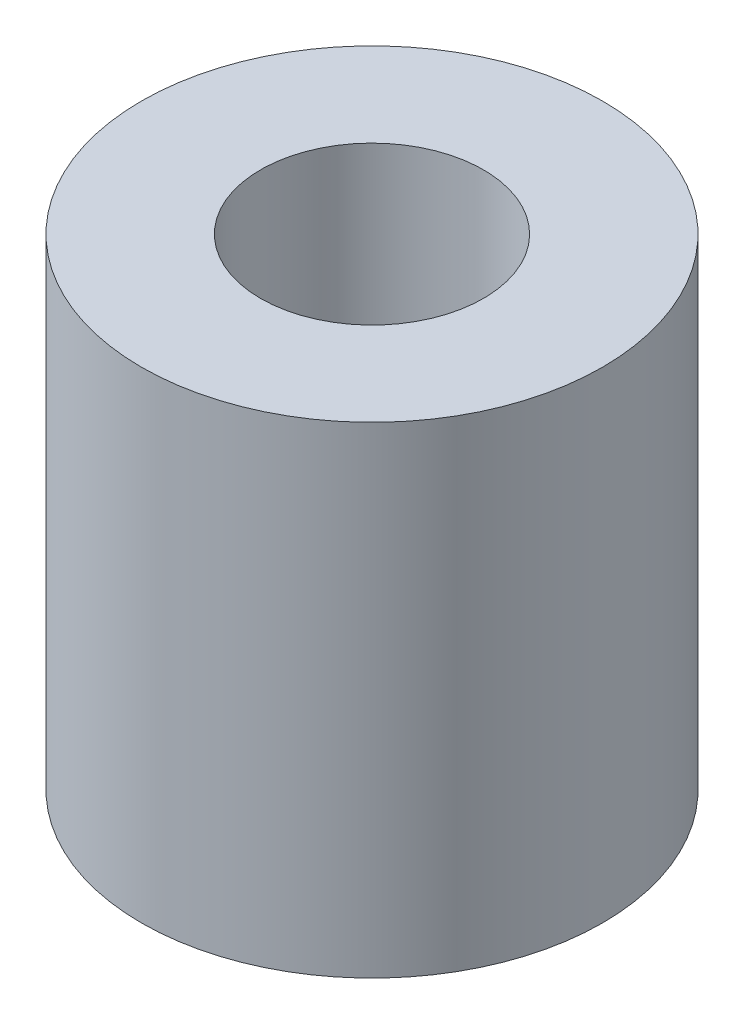
ISO-10303-21;
HEADER;
FILE_DESCRIPTION(('STEP AP214'),'2;1');
FILE_NAME('part.step','',(''),(''),'','','');
FILE_SCHEMA(('AUTOMOTIVE_DESIGN { 1 0 10303 214 1 1 1 1 }'));
ENDSEC;
DATA;
#1=APPLICATION_CONTEXT('core data for automotive mechanical design processes');
#2=APPLICATION_PROTOCOL_DEFINITION('international standard','automotive_design',2000,#1);
#3=PRODUCT_CONTEXT('',#1,'mechanical');
#4=PRODUCT('Part','Part','',(#3));
#5=PRODUCT_RELATED_PRODUCT_CATEGORY('part','',(#4));
#6=PRODUCT_DEFINITION_FORMATION('','',#4);
#7=PRODUCT_DEFINITION_CONTEXT('part definition',#1,'design');
#8=PRODUCT_DEFINITION('design','',#6,#7);
#9=PRODUCT_DEFINITION_SHAPE('','',#8);
#10=(LENGTH_UNIT() NAMED_UNIT(*) SI_UNIT(.MILLI.,.METRE.));
#11=(NAMED_UNIT(*) PLANE_ANGLE_UNIT() SI_UNIT($,.RADIAN.));
#12=(NAMED_UNIT(*) SI_UNIT($,.STERADIAN.) SOLID_ANGLE_UNIT());
#13=UNCERTAINTY_MEASURE_WITH_UNIT(LENGTH_MEASURE(1.E-05),#10,'distance_accuracy_value','');
#14=(GEOMETRIC_REPRESENTATION_CONTEXT(3) GLOBAL_UNCERTAINTY_ASSIGNED_CONTEXT((#13)) GLOBAL_UNIT_ASSIGNED_CONTEXT((#10,
#11,#12)) REPRESENTATION_CONTEXT('',''));
#15=CARTESIAN_POINT('',(0.,0.,0.));
#16=DIRECTION('',(0.,0.,1.));
#17=DIRECTION('',(1.,0.,0.));
#18=AXIS2_PLACEMENT_3D('',#15,#16,#17);
#19=CARTESIAN_POINT('',(0.,9.5,0.));
#20=DIRECTION('',(0.,1.,0.));
#21=DIRECTION('',(0.,0.,1.));
#22=AXIS2_PLACEMENT_3D('',#19,#20,#21);
#23=PLANE('',#22);
#24=CARTESIAN_POINT('',(0.,9.5,0.));
#25=DIRECTION('',(0.,1.,0.));
#26=DIRECTION('',(0.,0.,1.));
#27=AXIS2_PLACEMENT_3D('',#24,#25,#26);
#28=CIRCLE('',#27,4.55);
#29=CARTESIAN_POINT('',(0.,9.5,4.55));
#30=VERTEX_POINT('',#29);
#31=EDGE_CURVE('E10',#30,#30,#28,.T.);
#32=ORIENTED_EDGE('',*,*,#31,.T.);
#33=EDGE_LOOP('',(#32));
#34=FACE_BOUND('',#33,.T.);
#35=CARTESIAN_POINT('',(0.,9.5,0.));
#36=DIRECTION('',(0.,1.,0.));
#37=DIRECTION('',(0.,0.,1.));
#38=AXIS2_PLACEMENT_3D('',#35,#36,#37);
#39=CIRCLE('',#38,2.2);
#40=CARTESIAN_POINT('',(0.,9.5,2.2));
#41=VERTEX_POINT('',#40);
#42=EDGE_CURVE('E44',#41,#41,#39,.T.);
#43=ORIENTED_EDGE('',*,*,#42,.F.);
#44=EDGE_LOOP('',(#43));
#45=FACE_BOUND('',#44,.T.);
#46=ADVANCED_FACE('F33',(#34,#45),#23,.T.);
#47=CARTESIAN_POINT('',(0.,0.,0.));
#48=DIRECTION('',(0.,1.,0.));
#49=DIRECTION('',(0.,0.,1.));
#50=AXIS2_PLACEMENT_3D('',#47,#48,#49);
#51=PLANE('',#50);
#52=CARTESIAN_POINT('',(0.,0.,0.));
#53=DIRECTION('',(0.,1.,0.));
#54=DIRECTION('',(0.,0.,1.));
#55=AXIS2_PLACEMENT_3D('',#52,#53,#54);
#56=CIRCLE('',#55,4.55);
#57=CARTESIAN_POINT('',(0.,0.,4.55));
#58=VERTEX_POINT('',#57);
#59=EDGE_CURVE('E37',#58,#58,#56,.T.);
#60=ORIENTED_EDGE('',*,*,#59,.F.);
#61=EDGE_LOOP('',(#60));
#62=FACE_BOUND('',#61,.T.);
#63=CARTESIAN_POINT('',(0.,0.,0.));
#64=DIRECTION('',(0.,1.,0.));
#65=DIRECTION('',(0.,0.,1.));
#66=AXIS2_PLACEMENT_3D('',#63,#64,#65);
#67=CIRCLE('',#66,2.2);
#68=CARTESIAN_POINT('',(0.,0.,2.2));
#69=VERTEX_POINT('',#68);
#70=EDGE_CURVE('E46',#69,#69,#67,.T.);
#71=ORIENTED_EDGE('',*,*,#70,.T.);
#72=EDGE_LOOP('',(#71));
#73=FACE_BOUND('',#72,.T.);
#74=ADVANCED_FACE('F56',(#62,#73),#51,.F.);
#75=CARTESIAN_POINT('',(0.,9.5,0.));
#76=DIRECTION('',(0.,-1.,0.));
#77=DIRECTION('',(0.,0.,-1.));
#78=AXIS2_PLACEMENT_3D('',#75,#76,#77);
#79=CYLINDRICAL_SURFACE('',#78,4.55);
#80=ORIENTED_EDGE('',*,*,#31,.F.);
#81=EDGE_LOOP('',(#80));
#82=FACE_BOUND('',#81,.T.);
#83=ORIENTED_EDGE('',*,*,#59,.T.);
#84=EDGE_LOOP('',(#83));
#85=FACE_BOUND('',#84,.T.);
#86=ADVANCED_FACE('F35',(#82,#85),#79,.T.);
#87=CARTESIAN_POINT('',(0.,9.5,0.));
#88=DIRECTION('',(0.,-1.,0.));
#89=DIRECTION('',(0.,0.,-1.));
#90=AXIS2_PLACEMENT_3D('',#87,#88,#89);
#91=CYLINDRICAL_SURFACE('',#90,2.2);
#92=ORIENTED_EDGE('',*,*,#42,.T.);
#93=EDGE_LOOP('',(#92));
#94=FACE_BOUND('',#93,.T.);
#95=ORIENTED_EDGE('',*,*,#70,.F.);
#96=EDGE_LOOP('',(#95));
#97=FACE_BOUND('',#96,.T.);
#98=ADVANCED_FACE('F52',(#94,#97),#91,.F.);
#99=CLOSED_SHELL('',(#46,#74,#86,#98));
#100=MANIFOLD_SOLID_BREP('B2',#99);
#101=ADVANCED_BREP_SHAPE_REPRESENTATION('',(#18,#100),#14);
#102=SHAPE_DEFINITION_REPRESENTATION(#9,#101);
ENDSEC;
END-ISO-10303-21;
